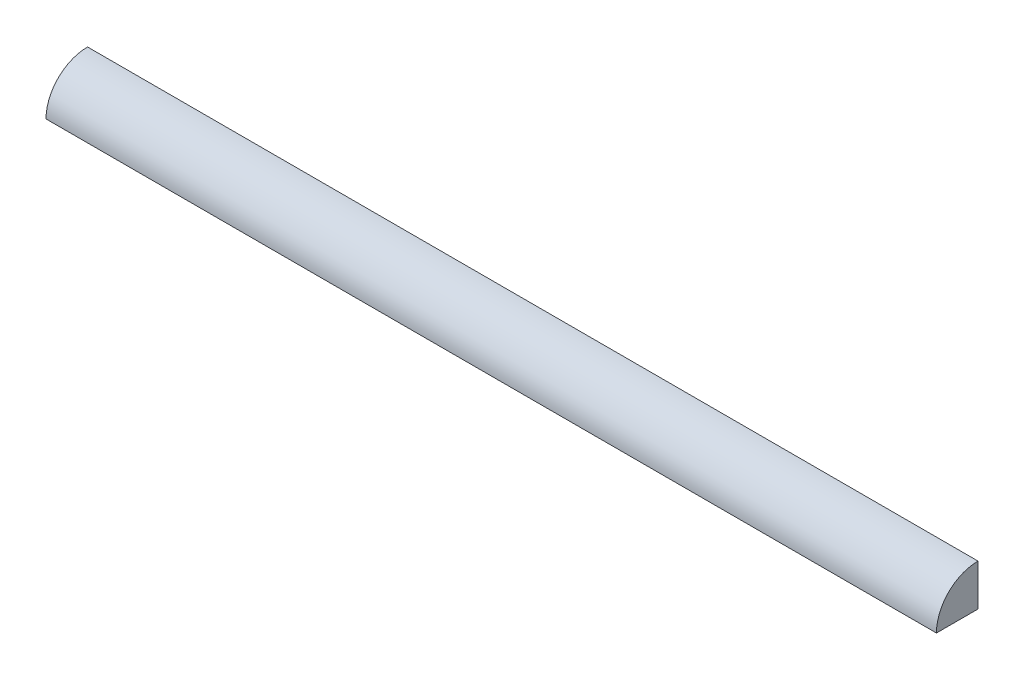
ISO-10303-21;
HEADER;
FILE_DESCRIPTION(('STEP AP214'),'2;1');
FILE_NAME('part.step','',(''),(''),'','','');
FILE_SCHEMA(('AUTOMOTIVE_DESIGN { 1 0 10303 214 1 1 1 1 }'));
ENDSEC;
DATA;
#1=APPLICATION_CONTEXT('core data for automotive mechanical design processes');
#2=APPLICATION_PROTOCOL_DEFINITION('international standard','automotive_design',2000,#1);
#3=PRODUCT_CONTEXT('',#1,'mechanical');
#4=PRODUCT('Part','Part','',(#3));
#5=PRODUCT_RELATED_PRODUCT_CATEGORY('part','',(#4));
#6=PRODUCT_DEFINITION_FORMATION('','',#4);
#7=PRODUCT_DEFINITION_CONTEXT('part definition',#1,'design');
#8=PRODUCT_DEFINITION('design','',#6,#7);
#9=PRODUCT_DEFINITION_SHAPE('','',#8);
#10=(LENGTH_UNIT() NAMED_UNIT(*) SI_UNIT(.MILLI.,.METRE.));
#11=(NAMED_UNIT(*) PLANE_ANGLE_UNIT() SI_UNIT($,.RADIAN.));
#12=(NAMED_UNIT(*) SI_UNIT($,.STERADIAN.) SOLID_ANGLE_UNIT());
#13=UNCERTAINTY_MEASURE_WITH_UNIT(LENGTH_MEASURE(1.E-05),#10,'distance_accuracy_value','');
#14=(GEOMETRIC_REPRESENTATION_CONTEXT(3) GLOBAL_UNCERTAINTY_ASSIGNED_CONTEXT((#13)) GLOBAL_UNIT_ASSIGNED_CONTEXT((#10,
#11,#12)) REPRESENTATION_CONTEXT('',''));
#15=CARTESIAN_POINT('',(0.,0.,0.));
#16=DIRECTION('',(0.,0.,1.));
#17=DIRECTION('',(1.,0.,0.));
#18=AXIS2_PLACEMENT_3D('',#15,#16,#17);
#19=CARTESIAN_POINT('',(-111.176470588235,18.7352941176471,0.));
#20=DIRECTION('',(-1.,0.,0.));
#21=DIRECTION('',(0.,-1.,0.));
#22=AXIS2_PLACEMENT_3D('',#19,#20,#21);
#23=CYLINDRICAL_SURFACE('',#22,28.);
#24=DIRECTION('',(-1.,0.,0.));
#25=VECTOR('',#24,1.);
#26=CARTESIAN_POINT('',(-111.176470588235,46.7352941176471,0.));
#27=LINE('',#26,#25);
#28=CARTESIAN_POINT('',(488.823529411765,46.7352941176471,0.));
#29=VERTEX_POINT('',#28);
#30=CARTESIAN_POINT('',(-111.176470588235,46.7352941176471,0.));
#31=VERTEX_POINT('',#30);
#32=EDGE_CURVE('E71',#29,#31,#27,.T.);
#33=ORIENTED_EDGE('',*,*,#32,.T.);
#34=CARTESIAN_POINT('',(-111.176470588235,18.7352941176471,0.));
#35=DIRECTION('',(1.,0.,0.));
#36=DIRECTION('',(0.,0.,-1.));
#37=AXIS2_PLACEMENT_3D('',#34,#35,#36);
#38=CIRCLE('',#37,28.);
#39=CARTESIAN_POINT('',(-111.176470588235,18.7352941176471,28.));
#40=VERTEX_POINT('',#39);
#41=EDGE_CURVE('E41',#40,#31,#38,.F.);
#42=ORIENTED_EDGE('',*,*,#41,.F.);
#43=DIRECTION('',(1.,0.,0.));
#44=VECTOR('',#43,1.);
#45=CARTESIAN_POINT('',(-111.176470588235,18.7352941176471,28.));
#46=LINE('',#45,#44);
#47=CARTESIAN_POINT('',(488.823529411765,18.7352941176471,28.));
#48=VERTEX_POINT('',#47);
#49=EDGE_CURVE('E74',#40,#48,#46,.T.);
#50=ORIENTED_EDGE('',*,*,#49,.T.);
#51=CARTESIAN_POINT('',(488.823529411765,18.7352941176471,0.));
#52=DIRECTION('',(-1.,0.,0.));
#53=DIRECTION('',(0.,0.,1.));
#54=AXIS2_PLACEMENT_3D('',#51,#52,#53);
#55=CIRCLE('',#54,28.);
#56=EDGE_CURVE('E11',#29,#48,#55,.F.);
#57=ORIENTED_EDGE('',*,*,#56,.F.);
#58=EDGE_LOOP('',(#33,#42,#50,#57));
#59=FACE_BOUND('',#58,.T.);
#60=ADVANCED_FACE('F33',(#59),#23,.T.);
#61=CARTESIAN_POINT('',(-111.176470588235,46.7352941176471,28.));
#62=DIRECTION('',(1.,0.,0.));
#63=DIRECTION('',(0.,0.,-1.));
#64=AXIS2_PLACEMENT_3D('',#61,#62,#63);
#65=PLANE('',#64);
#66=DIRECTION('',(0.,0.,-1.));
#67=VECTOR('',#66,1.);
#68=CARTESIAN_POINT('',(-111.176470588235,18.7352941176471,28.));
#69=LINE('',#68,#67);
#70=CARTESIAN_POINT('',(-111.176470588235,18.7352941176471,0.));
#71=VERTEX_POINT('',#70);
#72=EDGE_CURVE('E68',#40,#71,#69,.T.);
#73=ORIENTED_EDGE('',*,*,#72,.F.);
#74=ORIENTED_EDGE('',*,*,#41,.T.);
#75=DIRECTION('',(0.,-1.,0.));
#76=VECTOR('',#75,1.);
#77=CARTESIAN_POINT('',(-111.176470588235,46.7352941176471,0.));
#78=LINE('',#77,#76);
#79=EDGE_CURVE('E66',#31,#71,#78,.T.);
#80=ORIENTED_EDGE('',*,*,#79,.T.);
#81=EDGE_LOOP('',(#73,#74,#80));
#82=FACE_BOUND('',#81,.T.);
#83=ADVANCED_FACE('F64',(#82),#65,.F.);
#84=CARTESIAN_POINT('',(-111.176470588235,18.7352941176471,28.));
#85=DIRECTION('',(0.,1.,0.));
#86=DIRECTION('',(-1.,0.,0.));
#87=AXIS2_PLACEMENT_3D('',#84,#85,#86);
#88=PLANE('',#87);
#89=DIRECTION('',(1.,0.,0.));
#90=VECTOR('',#89,1.);
#91=CARTESIAN_POINT('',(-111.176470588235,18.7352941176471,0.));
#92=LINE('',#91,#90);
#93=CARTESIAN_POINT('',(488.823529411765,18.7352941176471,0.));
#94=VERTEX_POINT('',#93);
#95=EDGE_CURVE('E78',#71,#94,#92,.T.);
#96=ORIENTED_EDGE('',*,*,#95,.T.);
#97=DIRECTION('',(0.,0.,-1.));
#98=VECTOR('',#97,1.);
#99=CARTESIAN_POINT('',(488.823529411765,18.7352941176471,28.));
#100=LINE('',#99,#98);
#101=EDGE_CURVE('E84',#48,#94,#100,.T.);
#102=ORIENTED_EDGE('',*,*,#101,.F.);
#103=ORIENTED_EDGE('',*,*,#49,.F.);
#104=ORIENTED_EDGE('',*,*,#72,.T.);
#105=EDGE_LOOP('',(#96,#102,#103,#104));
#106=FACE_BOUND('',#105,.T.);
#107=ADVANCED_FACE('F87',(#106),#88,.F.);
#108=CARTESIAN_POINT('',(488.823529411765,46.7352941176471,28.));
#109=DIRECTION('',(-1.,0.,0.));
#110=DIRECTION('',(0.,0.,1.));
#111=AXIS2_PLACEMENT_3D('',#108,#109,#110);
#112=PLANE('',#111);
#113=DIRECTION('',(0.,1.,0.));
#114=VECTOR('',#113,1.);
#115=CARTESIAN_POINT('',(488.823529411765,46.7352941176471,0.));
#116=LINE('',#115,#114);
#117=EDGE_CURVE('E75',#94,#29,#116,.T.);
#118=ORIENTED_EDGE('',*,*,#117,.T.);
#119=ORIENTED_EDGE('',*,*,#56,.T.);
#120=ORIENTED_EDGE('',*,*,#101,.T.);
#121=EDGE_LOOP('',(#118,#119,#120));
#122=FACE_BOUND('',#121,.T.);
#123=ADVANCED_FACE('F89',(#122),#112,.F.);
#124=CARTESIAN_POINT('',(0.,0.,0.));
#125=DIRECTION('',(0.,0.,1.));
#126=DIRECTION('',(1.,0.,0.));
#127=AXIS2_PLACEMENT_3D('',#124,#125,#126);
#128=PLANE('',#127);
#129=ORIENTED_EDGE('',*,*,#79,.F.);
#130=ORIENTED_EDGE('',*,*,#32,.F.);
#131=ORIENTED_EDGE('',*,*,#117,.F.);
#132=ORIENTED_EDGE('',*,*,#95,.F.);
#133=EDGE_LOOP('',(#129,#130,#131,#132));
#134=FACE_BOUND('',#133,.T.);
#135=ADVANCED_FACE('F77',(#134),#128,.F.);
#136=CLOSED_SHELL('',(#60,#83,#107,#123,#135));
#137=MANIFOLD_SOLID_BREP('B2',#136);
#138=ADVANCED_BREP_SHAPE_REPRESENTATION('',(#18,#137),#14);
#139=SHAPE_DEFINITION_REPRESENTATION(#9,#138);
ENDSEC;
END-ISO-10303-21;
